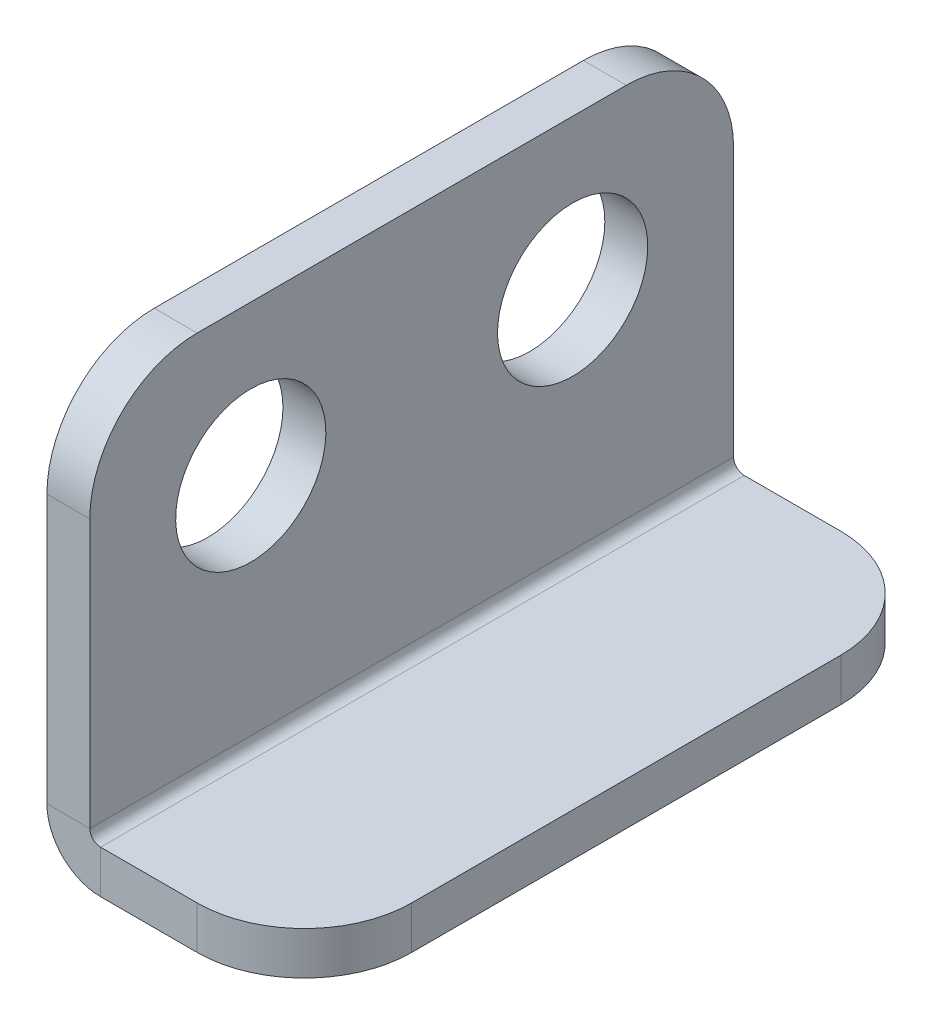
ISO-10303-21;
HEADER;
FILE_DESCRIPTION(('STEP AP214'),'2;1');
FILE_NAME('part.step','',(''),(''),'','','');
FILE_SCHEMA(('AUTOMOTIVE_DESIGN { 1 0 10303 214 1 1 1 1 }'));
ENDSEC;
DATA;
#1=APPLICATION_CONTEXT('core data for automotive mechanical design processes');
#2=APPLICATION_PROTOCOL_DEFINITION('international standard','automotive_design',2000,#1);
#3=PRODUCT_CONTEXT('',#1,'mechanical');
#4=PRODUCT('Part','Part','',(#3));
#5=PRODUCT_RELATED_PRODUCT_CATEGORY('part','',(#4));
#6=PRODUCT_DEFINITION_FORMATION('','',#4);
#7=PRODUCT_DEFINITION_CONTEXT('part definition',#1,'design');
#8=PRODUCT_DEFINITION('design','',#6,#7);
#9=PRODUCT_DEFINITION_SHAPE('','',#8);
#10=(LENGTH_UNIT() NAMED_UNIT(*) SI_UNIT(.MILLI.,.METRE.));
#11=(NAMED_UNIT(*) PLANE_ANGLE_UNIT() SI_UNIT($,.RADIAN.));
#12=(NAMED_UNIT(*) SI_UNIT($,.STERADIAN.) SOLID_ANGLE_UNIT());
#13=UNCERTAINTY_MEASURE_WITH_UNIT(LENGTH_MEASURE(1.E-05),#10,'distance_accuracy_value','');
#14=(GEOMETRIC_REPRESENTATION_CONTEXT(3) GLOBAL_UNCERTAINTY_ASSIGNED_CONTEXT((#13)) GLOBAL_UNIT_ASSIGNED_CONTEXT((#10,
#11,#12)) REPRESENTATION_CONTEXT('',''));
#15=CARTESIAN_POINT('',(0.,0.,0.));
#16=DIRECTION('',(0.,0.,1.));
#17=DIRECTION('',(1.,0.,0.));
#18=AXIS2_PLACEMENT_3D('',#15,#16,#17);
#19=CARTESIAN_POINT('',(2.5,0.,-15.));
#20=DIRECTION('',(0.,0.,-1.));
#21=DIRECTION('',(-1.,0.,0.));
#22=AXIS2_PLACEMENT_3D('',#19,#20,#21);
#23=PLANE('',#22);
#24=DIRECTION('',(0.,1.,0.));
#25=VECTOR('',#24,1.);
#26=CARTESIAN_POINT('',(2.5,0.,-15.));
#27=LINE('',#26,#25);
#28=CARTESIAN_POINT('',(2.5,0.,-15.));
#29=VERTEX_POINT('',#28);
#30=CARTESIAN_POINT('',(2.5,2.,-15.));
#31=VERTEX_POINT('',#30);
#32=EDGE_CURVE('E124',#29,#31,#27,.T.);
#33=ORIENTED_EDGE('',*,*,#32,.F.);
#34=CARTESIAN_POINT('',(2.5,2.5,-15.));
#35=DIRECTION('',(0.,0.,-1.));
#36=DIRECTION('',(-1.,0.,0.));
#37=AXIS2_PLACEMENT_3D('',#34,#35,#36);
#38=CIRCLE('',#37,2.5);
#39=CARTESIAN_POINT('',(0.,2.5,-15.));
#40=VERTEX_POINT('',#39);
#41=EDGE_CURVE('E170',#40,#29,#38,.F.);
#42=ORIENTED_EDGE('',*,*,#41,.F.);
#43=DIRECTION('',(-1.,0.,0.));
#44=VECTOR('',#43,1.);
#45=CARTESIAN_POINT('',(2.,2.5,-15.));
#46=LINE('',#45,#44);
#47=CARTESIAN_POINT('',(2.,2.5,-15.));
#48=VERTEX_POINT('',#47);
#49=EDGE_CURVE('E138',#48,#40,#46,.T.);
#50=ORIENTED_EDGE('',*,*,#49,.F.);
#51=CARTESIAN_POINT('',(2.5,2.5,-15.));
#52=DIRECTION('',(0.,0.,1.));
#53=DIRECTION('',(1.,0.,0.));
#54=AXIS2_PLACEMENT_3D('',#51,#52,#53);
#55=CIRCLE('',#54,0.5);
#56=EDGE_CURVE('E142',#48,#31,#55,.T.);
#57=ORIENTED_EDGE('',*,*,#56,.T.);
#58=EDGE_LOOP('',(#33,#42,#50,#57));
#59=FACE_BOUND('',#58,.T.);
#60=ADVANCED_FACE('F34',(#59),#23,.T.);
#61=CARTESIAN_POINT('',(2.,2.5,-15.));
#62=DIRECTION('',(0.,0.,-1.));
#63=DIRECTION('',(-1.,0.,0.));
#64=AXIS2_PLACEMENT_3D('',#61,#62,#63);
#65=PLANE('',#64);
#66=DIRECTION('',(1.,0.,0.));
#67=VECTOR('',#66,1.);
#68=CARTESIAN_POINT('',(0.,2.,-15.));
#69=LINE('',#68,#67);
#70=CARTESIAN_POINT('',(7.,2.,-15.));
#71=VERTEX_POINT('',#70);
#72=EDGE_CURVE('E129',#31,#71,#69,.T.);
#73=ORIENTED_EDGE('',*,*,#72,.T.);
#74=DIRECTION('',(0.,-1.,0.));
#75=VECTOR('',#74,1.);
#76=CARTESIAN_POINT('',(7.,0.,-15.));
#77=LINE('',#76,#75);
#78=CARTESIAN_POINT('',(7.,0.,-15.));
#79=VERTEX_POINT('',#78);
#80=EDGE_CURVE('E222',#71,#79,#77,.T.);
#81=ORIENTED_EDGE('',*,*,#80,.T.);
#82=DIRECTION('',(1.,0.,0.));
#83=VECTOR('',#82,1.);
#84=CARTESIAN_POINT('',(0.,0.,-15.));
#85=LINE('',#84,#83);
#86=EDGE_CURVE('E132',#29,#79,#85,.T.);
#87=ORIENTED_EDGE('',*,*,#86,.F.);
#88=ORIENTED_EDGE('',*,*,#32,.T.);
#89=EDGE_LOOP('',(#73,#81,#87,#88));
#90=FACE_BOUND('',#89,.T.);
#91=ADVANCED_FACE('F126',(#90),#65,.T.);
#92=CARTESIAN_POINT('',(0.,2.5,15.));
#93=DIRECTION('',(0.,0.,1.));
#94=DIRECTION('',(1.,0.,0.));
#95=AXIS2_PLACEMENT_3D('',#92,#93,#94);
#96=PLANE('',#95);
#97=DIRECTION('',(1.,0.,0.));
#98=VECTOR('',#97,1.);
#99=CARTESIAN_POINT('',(0.,2.5,15.));
#100=LINE('',#99,#98);
#101=CARTESIAN_POINT('',(0.,2.5,15.));
#102=VERTEX_POINT('',#101);
#103=CARTESIAN_POINT('',(2.,2.5,15.));
#104=VERTEX_POINT('',#103);
#105=EDGE_CURVE('E203',#102,#104,#100,.T.);
#106=ORIENTED_EDGE('',*,*,#105,.F.);
#107=CARTESIAN_POINT('',(2.5,2.5,15.));
#108=DIRECTION('',(0.,0.,-1.));
#109=DIRECTION('',(-1.,0.,0.));
#110=AXIS2_PLACEMENT_3D('',#107,#108,#109);
#111=CIRCLE('',#110,2.5);
#112=CARTESIAN_POINT('',(2.5,0.,15.));
#113=VERTEX_POINT('',#112);
#114=EDGE_CURVE('E163',#102,#113,#111,.F.);
#115=ORIENTED_EDGE('',*,*,#114,.T.);
#116=DIRECTION('',(0.,-1.,0.));
#117=VECTOR('',#116,1.);
#118=CARTESIAN_POINT('',(2.5,2.,15.));
#119=LINE('',#118,#117);
#120=CARTESIAN_POINT('',(2.5,2.,15.));
#121=VERTEX_POINT('',#120);
#122=EDGE_CURVE('E188',#121,#113,#119,.T.);
#123=ORIENTED_EDGE('',*,*,#122,.F.);
#124=CARTESIAN_POINT('',(2.5,2.5,15.));
#125=DIRECTION('',(0.,0.,1.));
#126=DIRECTION('',(1.,0.,0.));
#127=AXIS2_PLACEMENT_3D('',#124,#125,#126);
#128=CIRCLE('',#127,0.5);
#129=EDGE_CURVE('E155',#104,#121,#128,.T.);
#130=ORIENTED_EDGE('',*,*,#129,.F.);
#131=EDGE_LOOP('',(#106,#115,#123,#130));
#132=FACE_BOUND('',#131,.T.);
#133=ADVANCED_FACE('F265',(#132),#96,.T.);
#134=CARTESIAN_POINT('',(2.5,2.,15.));
#135=DIRECTION('',(0.,0.,1.));
#136=DIRECTION('',(1.,0.,0.));
#137=AXIS2_PLACEMENT_3D('',#134,#135,#136);
#138=PLANE('',#137);
#139=DIRECTION('',(0.,-1.,0.));
#140=VECTOR('',#139,1.);
#141=CARTESIAN_POINT('',(2.,20.,15.));
#142=LINE('',#141,#140);
#143=CARTESIAN_POINT('',(2.,15.,15.));
#144=VERTEX_POINT('',#143);
#145=EDGE_CURVE('E179',#144,#104,#142,.T.);
#146=ORIENTED_EDGE('',*,*,#145,.F.);
#147=DIRECTION('',(1.,0.,0.));
#148=VECTOR('',#147,1.);
#149=CARTESIAN_POINT('',(0.,15.,15.));
#150=LINE('',#149,#148);
#151=CARTESIAN_POINT('',(0.,15.,15.));
#152=VERTEX_POINT('',#151);
#153=EDGE_CURVE('E11',#144,#152,#150,.F.);
#154=ORIENTED_EDGE('',*,*,#153,.T.);
#155=DIRECTION('',(0.,-1.,0.));
#156=VECTOR('',#155,1.);
#157=CARTESIAN_POINT('',(0.,20.,15.));
#158=LINE('',#157,#156);
#159=EDGE_CURVE('E181',#152,#102,#158,.T.);
#160=ORIENTED_EDGE('',*,*,#159,.T.);
#161=ORIENTED_EDGE('',*,*,#105,.T.);
#162=EDGE_LOOP('',(#146,#154,#160,#161));
#163=FACE_BOUND('',#162,.T.);
#164=ADVANCED_FACE('F300',(#163),#138,.T.);
#165=CARTESIAN_POINT('',(0.,0.,-15.));
#166=DIRECTION('',(0.,-1.,0.));
#167=DIRECTION('',(0.,0.,-1.));
#168=AXIS2_PLACEMENT_3D('',#165,#166,#167);
#169=PLANE('',#168);
#170=ORIENTED_EDGE('',*,*,#86,.T.);
#171=CARTESIAN_POINT('',(7.,0.,-10.));
#172=DIRECTION('',(0.,-1.,0.));
#173=DIRECTION('',(0.,0.,-1.));
#174=AXIS2_PLACEMENT_3D('',#171,#172,#173);
#175=CIRCLE('',#174,5.);
#176=CARTESIAN_POINT('',(12.,0.,-10.));
#177=VERTEX_POINT('',#176);
#178=EDGE_CURVE('E226',#79,#177,#175,.T.);
#179=ORIENTED_EDGE('',*,*,#178,.T.);
#180=DIRECTION('',(0.,0.,1.));
#181=VECTOR('',#180,1.);
#182=CARTESIAN_POINT('',(12.,0.,-15.));
#183=LINE('',#182,#181);
#184=CARTESIAN_POINT('',(12.,0.,10.));
#185=VERTEX_POINT('',#184);
#186=EDGE_CURVE('E172',#177,#185,#183,.T.);
#187=ORIENTED_EDGE('',*,*,#186,.T.);
#188=CARTESIAN_POINT('',(7.,0.,10.));
#189=DIRECTION('',(0.,-1.,0.));
#190=DIRECTION('',(0.,0.,-1.));
#191=AXIS2_PLACEMENT_3D('',#188,#189,#190);
#192=CIRCLE('',#191,5.);
#193=CARTESIAN_POINT('',(7.,0.,15.));
#194=VERTEX_POINT('',#193);
#195=EDGE_CURVE('E224',#185,#194,#192,.T.);
#196=ORIENTED_EDGE('',*,*,#195,.T.);
#197=DIRECTION('',(1.,0.,0.));
#198=VECTOR('',#197,1.);
#199=CARTESIAN_POINT('',(0.,0.,15.));
#200=LINE('',#199,#198);
#201=EDGE_CURVE('E173',#113,#194,#200,.T.);
#202=ORIENTED_EDGE('',*,*,#201,.F.);
#203=DIRECTION('',(0.,0.,1.));
#204=VECTOR('',#203,1.);
#205=CARTESIAN_POINT('',(2.5,0.,-15.));
#206=LINE('',#205,#204);
#207=EDGE_CURVE('E185',#29,#113,#206,.T.);
#208=ORIENTED_EDGE('',*,*,#207,.F.);
#209=EDGE_LOOP('',(#170,#179,#187,#196,#202,#208));
#210=FACE_BOUND('',#209,.T.);
#211=ADVANCED_FACE('F242',(#210),#169,.T.);
#212=CARTESIAN_POINT('',(2.5,2.5,-15.));
#213=DIRECTION('',(0.,0.,1.));
#214=DIRECTION('',(1.,0.,0.));
#215=AXIS2_PLACEMENT_3D('',#212,#213,#214);
#216=CYLINDRICAL_SURFACE('',#215,2.5);
#217=ORIENTED_EDGE('',*,*,#114,.F.);
#218=DIRECTION('',(0.,0.,1.));
#219=VECTOR('',#218,1.);
#220=CARTESIAN_POINT('',(0.,2.5,-15.));
#221=LINE('',#220,#219);
#222=EDGE_CURVE('E189',#40,#102,#221,.T.);
#223=ORIENTED_EDGE('',*,*,#222,.F.);
#224=ORIENTED_EDGE('',*,*,#41,.T.);
#225=ORIENTED_EDGE('',*,*,#207,.T.);
#226=EDGE_LOOP('',(#217,#223,#224,#225));
#227=FACE_BOUND('',#226,.T.);
#228=ADVANCED_FACE('F246',(#227),#216,.T.);
#229=CARTESIAN_POINT('',(0.,20.,-15.));
#230=DIRECTION('',(-1.,0.,0.));
#231=DIRECTION('',(0.,-1.,0.));
#232=AXIS2_PLACEMENT_3D('',#229,#230,#231);
#233=PLANE('',#232);
#234=CARTESIAN_POINT('',(0.,13.,-7.5));
#235=DIRECTION('',(-1.,0.,0.));
#236=DIRECTION('',(0.,-1.,0.));
#237=AXIS2_PLACEMENT_3D('',#234,#235,#236);
#238=CIRCLE('',#237,3.5);
#239=CARTESIAN_POINT('',(0.,9.5,-7.5));
#240=VERTEX_POINT('',#239);
#241=EDGE_CURVE('E343',#240,#240,#238,.F.);
#242=ORIENTED_EDGE('',*,*,#241,.T.);
#243=EDGE_LOOP('',(#242));
#244=FACE_BOUND('',#243,.T.);
#245=CARTESIAN_POINT('',(0.,13.,7.5));
#246=DIRECTION('',(-1.,0.,0.));
#247=DIRECTION('',(0.,-1.,0.));
#248=AXIS2_PLACEMENT_3D('',#245,#246,#247);
#249=CIRCLE('',#248,3.5);
#250=CARTESIAN_POINT('',(0.,9.5,7.5));
#251=VERTEX_POINT('',#250);
#252=EDGE_CURVE('E336',#251,#251,#249,.F.);
#253=ORIENTED_EDGE('',*,*,#252,.T.);
#254=EDGE_LOOP('',(#253));
#255=FACE_BOUND('',#254,.T.);
#256=DIRECTION('',(0.,0.,1.));
#257=VECTOR('',#256,1.);
#258=CARTESIAN_POINT('',(0.,20.,-15.));
#259=LINE('',#258,#257);
#260=CARTESIAN_POINT('',(0.,20.,-10.));
#261=VERTEX_POINT('',#260);
#262=CARTESIAN_POINT('',(0.,20.,10.));
#263=VERTEX_POINT('',#262);
#264=EDGE_CURVE('E192',#261,#263,#259,.T.);
#265=ORIENTED_EDGE('',*,*,#264,.F.);
#266=CARTESIAN_POINT('',(0.,15.,-10.));
#267=DIRECTION('',(-1.,0.,0.));
#268=DIRECTION('',(0.,-1.,0.));
#269=AXIS2_PLACEMENT_3D('',#266,#267,#268);
#270=CIRCLE('',#269,5.);
#271=CARTESIAN_POINT('',(0.,15.,-15.));
#272=VERTEX_POINT('',#271);
#273=EDGE_CURVE('E220',#261,#272,#270,.T.);
#274=ORIENTED_EDGE('',*,*,#273,.T.);
#275=DIRECTION('',(0.,-1.,0.));
#276=VECTOR('',#275,1.);
#277=CARTESIAN_POINT('',(0.,20.,-15.));
#278=LINE('',#277,#276);
#279=EDGE_CURVE('E168',#272,#40,#278,.T.);
#280=ORIENTED_EDGE('',*,*,#279,.T.);
#281=ORIENTED_EDGE('',*,*,#222,.T.);
#282=ORIENTED_EDGE('',*,*,#159,.F.);
#283=CARTESIAN_POINT('',(0.,15.,10.));
#284=DIRECTION('',(-1.,0.,0.));
#285=DIRECTION('',(0.,-1.,0.));
#286=AXIS2_PLACEMENT_3D('',#283,#284,#285);
#287=CIRCLE('',#286,5.);
#288=EDGE_CURVE('E218',#152,#263,#287,.T.);
#289=ORIENTED_EDGE('',*,*,#288,.T.);
#290=EDGE_LOOP('',(#265,#274,#280,#281,#282,#289));
#291=FACE_BOUND('',#290,.T.);
#292=ADVANCED_FACE('F251',(#244,#255,#291),#233,.T.);
#293=CARTESIAN_POINT('',(0.,20.,-15.));
#294=DIRECTION('',(0.,-1.,0.));
#295=DIRECTION('',(0.,0.,-1.));
#296=AXIS2_PLACEMENT_3D('',#293,#294,#295);
#297=PLANE('',#296);
#298=DIRECTION('',(0.,0.,1.));
#299=VECTOR('',#298,1.);
#300=CARTESIAN_POINT('',(2.,20.,-15.));
#301=LINE('',#300,#299);
#302=CARTESIAN_POINT('',(2.,20.,-10.));
#303=VERTEX_POINT('',#302);
#304=CARTESIAN_POINT('',(2.,20.,10.));
#305=VERTEX_POINT('',#304);
#306=EDGE_CURVE('E195',#303,#305,#301,.T.);
#307=ORIENTED_EDGE('',*,*,#306,.F.);
#308=DIRECTION('',(1.,0.,0.));
#309=VECTOR('',#308,1.);
#310=CARTESIAN_POINT('',(0.,20.,-10.));
#311=LINE('',#310,#309);
#312=EDGE_CURVE('E216',#303,#261,#311,.F.);
#313=ORIENTED_EDGE('',*,*,#312,.T.);
#314=ORIENTED_EDGE('',*,*,#264,.T.);
#315=DIRECTION('',(1.,0.,0.));
#316=VECTOR('',#315,1.);
#317=CARTESIAN_POINT('',(2.,20.,10.));
#318=LINE('',#317,#316);
#319=EDGE_CURVE('E213',#263,#305,#318,.T.);
#320=ORIENTED_EDGE('',*,*,#319,.T.);
#321=EDGE_LOOP('',(#307,#313,#314,#320));
#322=FACE_BOUND('',#321,.T.);
#323=ADVANCED_FACE('F296',(#322),#297,.F.);
#324=CARTESIAN_POINT('',(2.,20.,-15.));
#325=DIRECTION('',(-1.,0.,0.));
#326=DIRECTION('',(0.,-1.,0.));
#327=AXIS2_PLACEMENT_3D('',#324,#325,#326);
#328=PLANE('',#327);
#329=CARTESIAN_POINT('',(2.,13.,-7.5));
#330=DIRECTION('',(1.,0.,0.));
#331=DIRECTION('',(0.,1.,0.));
#332=AXIS2_PLACEMENT_3D('',#329,#330,#331);
#333=CIRCLE('',#332,3.5);
#334=CARTESIAN_POINT('',(2.,16.5,-7.5));
#335=VERTEX_POINT('',#334);
#336=EDGE_CURVE('E341',#335,#335,#333,.T.);
#337=ORIENTED_EDGE('',*,*,#336,.F.);
#338=EDGE_LOOP('',(#337));
#339=FACE_BOUND('',#338,.T.);
#340=CARTESIAN_POINT('',(2.,13.,7.5));
#341=DIRECTION('',(1.,0.,0.));
#342=DIRECTION('',(0.,1.,0.));
#343=AXIS2_PLACEMENT_3D('',#340,#341,#342);
#344=CIRCLE('',#343,3.5);
#345=CARTESIAN_POINT('',(2.,16.5,7.5));
#346=VERTEX_POINT('',#345);
#347=EDGE_CURVE('E176',#346,#346,#344,.T.);
#348=ORIENTED_EDGE('',*,*,#347,.F.);
#349=EDGE_LOOP('',(#348));
#350=FACE_BOUND('',#349,.T.);
#351=DIRECTION('',(0.,-1.,0.));
#352=VECTOR('',#351,1.);
#353=CARTESIAN_POINT('',(2.,20.,-15.));
#354=LINE('',#353,#352);
#355=CARTESIAN_POINT('',(2.,15.,-15.));
#356=VERTEX_POINT('',#355);
#357=EDGE_CURVE('E148',#356,#48,#354,.T.);
#358=ORIENTED_EDGE('',*,*,#357,.F.);
#359=CARTESIAN_POINT('',(2.,15.,-10.));
#360=DIRECTION('',(-1.,0.,0.));
#361=DIRECTION('',(0.,-1.,0.));
#362=AXIS2_PLACEMENT_3D('',#359,#360,#361);
#363=CIRCLE('',#362,5.);
#364=EDGE_CURVE('E211',#356,#303,#363,.F.);
#365=ORIENTED_EDGE('',*,*,#364,.T.);
#366=ORIENTED_EDGE('',*,*,#306,.T.);
#367=CARTESIAN_POINT('',(2.,15.,10.));
#368=DIRECTION('',(-1.,0.,0.));
#369=DIRECTION('',(0.,-1.,0.));
#370=AXIS2_PLACEMENT_3D('',#367,#368,#369);
#371=CIRCLE('',#370,5.);
#372=EDGE_CURVE('E209',#305,#144,#371,.F.);
#373=ORIENTED_EDGE('',*,*,#372,.T.);
#374=ORIENTED_EDGE('',*,*,#145,.T.);
#375=DIRECTION('',(0.,0.,1.));
#376=VECTOR('',#375,1.);
#377=CARTESIAN_POINT('',(2.,2.5,-15.));
#378=LINE('',#377,#376);
#379=EDGE_CURVE('E156',#48,#104,#378,.T.);
#380=ORIENTED_EDGE('',*,*,#379,.F.);
#381=EDGE_LOOP('',(#358,#365,#366,#373,#374,#380));
#382=FACE_BOUND('',#381,.T.);
#383=ADVANCED_FACE('F260',(#339,#350,#382),#328,.F.);
#384=CARTESIAN_POINT('',(2.5,2.5,-15.));
#385=DIRECTION('',(0.,0.,1.));
#386=DIRECTION('',(1.,0.,0.));
#387=AXIS2_PLACEMENT_3D('',#384,#385,#386);
#388=CYLINDRICAL_SURFACE('',#387,0.5);
#389=ORIENTED_EDGE('',*,*,#129,.T.);
#390=DIRECTION('',(0.,0.,1.));
#391=VECTOR('',#390,1.);
#392=CARTESIAN_POINT('',(2.5,2.,-15.));
#393=LINE('',#392,#391);
#394=EDGE_CURVE('E152',#31,#121,#393,.T.);
#395=ORIENTED_EDGE('',*,*,#394,.F.);
#396=ORIENTED_EDGE('',*,*,#56,.F.);
#397=ORIENTED_EDGE('',*,*,#379,.T.);
#398=EDGE_LOOP('',(#389,#395,#396,#397));
#399=FACE_BOUND('',#398,.T.);
#400=ADVANCED_FACE('F153',(#399),#388,.F.);
#401=CARTESIAN_POINT('',(0.,2.,-15.));
#402=DIRECTION('',(0.,-1.,0.));
#403=DIRECTION('',(0.,0.,-1.));
#404=AXIS2_PLACEMENT_3D('',#401,#402,#403);
#405=PLANE('',#404);
#406=DIRECTION('',(0.,0.,1.));
#407=VECTOR('',#406,1.);
#408=CARTESIAN_POINT('',(12.,2.,-15.));
#409=LINE('',#408,#407);
#410=CARTESIAN_POINT('',(12.,2.,-10.));
#411=VERTEX_POINT('',#410);
#412=CARTESIAN_POINT('',(12.,2.,10.));
#413=VERTEX_POINT('',#412);
#414=EDGE_CURVE('E157',#411,#413,#409,.T.);
#415=ORIENTED_EDGE('',*,*,#414,.F.);
#416=CARTESIAN_POINT('',(7.,2.,-10.));
#417=DIRECTION('',(0.,-1.,0.));
#418=DIRECTION('',(0.,0.,-1.));
#419=AXIS2_PLACEMENT_3D('',#416,#417,#418);
#420=CIRCLE('',#419,5.);
#421=EDGE_CURVE('E161',#411,#71,#420,.F.);
#422=ORIENTED_EDGE('',*,*,#421,.T.);
#423=ORIENTED_EDGE('',*,*,#72,.F.);
#424=ORIENTED_EDGE('',*,*,#394,.T.);
#425=DIRECTION('',(1.,0.,0.));
#426=VECTOR('',#425,1.);
#427=CARTESIAN_POINT('',(0.,2.,15.));
#428=LINE('',#427,#426);
#429=CARTESIAN_POINT('',(7.,2.,15.));
#430=VERTEX_POINT('',#429);
#431=EDGE_CURVE('E175',#121,#430,#428,.T.);
#432=ORIENTED_EDGE('',*,*,#431,.T.);
#433=CARTESIAN_POINT('',(7.,2.,10.));
#434=DIRECTION('',(0.,-1.,0.));
#435=DIRECTION('',(0.,0.,-1.));
#436=AXIS2_PLACEMENT_3D('',#433,#434,#435);
#437=CIRCLE('',#436,5.);
#438=EDGE_CURVE('E55',#430,#413,#437,.F.);
#439=ORIENTED_EDGE('',*,*,#438,.T.);
#440=EDGE_LOOP('',(#415,#422,#423,#424,#432,#439));
#441=FACE_BOUND('',#440,.T.);
#442=ADVANCED_FACE('F159',(#441),#405,.F.);
#443=CARTESIAN_POINT('',(12.,2.,-15.));
#444=DIRECTION('',(-1.,0.,0.));
#445=DIRECTION('',(0.,0.,1.));
#446=AXIS2_PLACEMENT_3D('',#443,#444,#445);
#447=PLANE('',#446);
#448=ORIENTED_EDGE('',*,*,#186,.F.);
#449=DIRECTION('',(0.,-1.,0.));
#450=VECTOR('',#449,1.);
#451=CARTESIAN_POINT('',(12.,2.,-10.));
#452=LINE('',#451,#450);
#453=EDGE_CURVE('E231',#177,#411,#452,.F.);
#454=ORIENTED_EDGE('',*,*,#453,.T.);
#455=ORIENTED_EDGE('',*,*,#414,.T.);
#456=DIRECTION('',(0.,-1.,0.));
#457=VECTOR('',#456,1.);
#458=CARTESIAN_POINT('',(12.,0.,10.));
#459=LINE('',#458,#457);
#460=EDGE_CURVE('E228',#413,#185,#459,.T.);
#461=ORIENTED_EDGE('',*,*,#460,.T.);
#462=EDGE_LOOP('',(#448,#454,#455,#461));
#463=FACE_BOUND('',#462,.T.);
#464=ADVANCED_FACE('F237',(#463),#447,.F.);
#465=CARTESIAN_POINT('',(2.5,2.5,-15.));
#466=DIRECTION('',(0.,0.,1.));
#467=DIRECTION('',(1.,0.,0.));
#468=AXIS2_PLACEMENT_3D('',#465,#466,#467);
#469=PLANE('',#468);
#470=ORIENTED_EDGE('',*,*,#279,.F.);
#471=DIRECTION('',(1.,0.,0.));
#472=VECTOR('',#471,1.);
#473=CARTESIAN_POINT('',(2.5,15.,-15.));
#474=LINE('',#473,#472);
#475=EDGE_CURVE('E137',#272,#356,#474,.T.);
#476=ORIENTED_EDGE('',*,*,#475,.T.);
#477=ORIENTED_EDGE('',*,*,#357,.T.);
#478=ORIENTED_EDGE('',*,*,#49,.T.);
#479=EDGE_LOOP('',(#470,#476,#477,#478));
#480=FACE_BOUND('',#479,.T.);
#481=ADVANCED_FACE('F257',(#480),#469,.F.);
#482=CARTESIAN_POINT('',(2.5,2.5,15.));
#483=DIRECTION('',(0.,0.,1.));
#484=DIRECTION('',(1.,0.,0.));
#485=AXIS2_PLACEMENT_3D('',#482,#483,#484);
#486=PLANE('',#485);
#487=ORIENTED_EDGE('',*,*,#201,.T.);
#488=DIRECTION('',(0.,-1.,0.));
#489=VECTOR('',#488,1.);
#490=CARTESIAN_POINT('',(7.,2.,15.));
#491=LINE('',#490,#489);
#492=EDGE_CURVE('E42',#194,#430,#491,.F.);
#493=ORIENTED_EDGE('',*,*,#492,.T.);
#494=ORIENTED_EDGE('',*,*,#431,.F.);
#495=ORIENTED_EDGE('',*,*,#122,.T.);
#496=EDGE_LOOP('',(#487,#493,#494,#495));
#497=FACE_BOUND('',#496,.T.);
#498=ADVANCED_FACE('F266',(#497),#486,.T.);
#499=CARTESIAN_POINT('',(-0.001000000000001,13.,7.5));
#500=DIRECTION('',(1.,0.,0.));
#501=DIRECTION('',(0.,1.,0.));
#502=AXIS2_PLACEMENT_3D('',#499,#500,#501);
#503=CYLINDRICAL_SURFACE('',#502,3.5);
#504=ORIENTED_EDGE('',*,*,#252,.F.);
#505=EDGE_LOOP('',(#504));
#506=FACE_BOUND('',#505,.T.);
#507=ORIENTED_EDGE('',*,*,#347,.T.);
#508=EDGE_LOOP('',(#507));
#509=FACE_BOUND('',#508,.T.);
#510=ADVANCED_FACE('F291',(#506,#509),#503,.F.);
#511=CARTESIAN_POINT('',(-0.001000000000001,13.,-7.5));
#512=DIRECTION('',(1.,0.,0.));
#513=DIRECTION('',(0.,1.,0.));
#514=AXIS2_PLACEMENT_3D('',#511,#512,#513);
#515=CYLINDRICAL_SURFACE('',#514,3.5);
#516=ORIENTED_EDGE('',*,*,#241,.F.);
#517=EDGE_LOOP('',(#516));
#518=FACE_BOUND('',#517,.T.);
#519=ORIENTED_EDGE('',*,*,#336,.T.);
#520=EDGE_LOOP('',(#519));
#521=FACE_BOUND('',#520,.T.);
#522=ADVANCED_FACE('F286',(#518,#521),#515,.F.);
#523=CARTESIAN_POINT('',(2.5,15.,-10.));
#524=DIRECTION('',(1.,0.,0.));
#525=DIRECTION('',(0.,0.,-1.));
#526=AXIS2_PLACEMENT_3D('',#523,#524,#525);
#527=CYLINDRICAL_SURFACE('',#526,5.);
#528=ORIENTED_EDGE('',*,*,#273,.F.);
#529=ORIENTED_EDGE('',*,*,#312,.F.);
#530=ORIENTED_EDGE('',*,*,#364,.F.);
#531=ORIENTED_EDGE('',*,*,#475,.F.);
#532=EDGE_LOOP('',(#528,#529,#530,#531));
#533=FACE_BOUND('',#532,.T.);
#534=ADVANCED_FACE('F275',(#533),#527,.T.);
#535=CARTESIAN_POINT('',(7.,2.5,-10.));
#536=DIRECTION('',(0.,1.,0.));
#537=DIRECTION('',(0.,0.,1.));
#538=AXIS2_PLACEMENT_3D('',#535,#536,#537);
#539=CYLINDRICAL_SURFACE('',#538,5.);
#540=ORIENTED_EDGE('',*,*,#421,.F.);
#541=ORIENTED_EDGE('',*,*,#453,.F.);
#542=ORIENTED_EDGE('',*,*,#178,.F.);
#543=ORIENTED_EDGE('',*,*,#80,.F.);
#544=EDGE_LOOP('',(#540,#541,#542,#543));
#545=FACE_BOUND('',#544,.T.);
#546=ADVANCED_FACE('F240',(#545),#539,.T.);
#547=CARTESIAN_POINT('',(7.,2.,10.));
#548=DIRECTION('',(0.,1.,0.));
#549=DIRECTION('',(0.,0.,1.));
#550=AXIS2_PLACEMENT_3D('',#547,#548,#549);
#551=CYLINDRICAL_SURFACE('',#550,5.);
#552=ORIENTED_EDGE('',*,*,#438,.F.);
#553=ORIENTED_EDGE('',*,*,#492,.F.);
#554=ORIENTED_EDGE('',*,*,#195,.F.);
#555=ORIENTED_EDGE('',*,*,#460,.F.);
#556=EDGE_LOOP('',(#552,#553,#554,#555));
#557=FACE_BOUND('',#556,.T.);
#558=ADVANCED_FACE('F268',(#557),#551,.T.);
#559=CARTESIAN_POINT('',(0.,15.,10.));
#560=DIRECTION('',(-1.,0.,0.));
#561=DIRECTION('',(0.,0.,1.));
#562=AXIS2_PLACEMENT_3D('',#559,#560,#561);
#563=CYLINDRICAL_SURFACE('',#562,5.);
#564=ORIENTED_EDGE('',*,*,#288,.F.);
#565=ORIENTED_EDGE('',*,*,#153,.F.);
#566=ORIENTED_EDGE('',*,*,#372,.F.);
#567=ORIENTED_EDGE('',*,*,#319,.F.);
#568=EDGE_LOOP('',(#564,#565,#566,#567));
#569=FACE_BOUND('',#568,.T.);
#570=ADVANCED_FACE('F36',(#569),#563,.T.);
#571=CLOSED_SHELL('',(#60,#91,#133,#164,#211,#228,#292,#323,#383,#400,#442,#464,#481,#498,#510,
#522,#534,#546,#558,#570));
#572=MANIFOLD_SOLID_BREP('B2',#571);
#573=ADVANCED_BREP_SHAPE_REPRESENTATION('',(#18,#572),#14);
#574=SHAPE_DEFINITION_REPRESENTATION(#9,#573);
ENDSEC;
END-ISO-10303-21;
